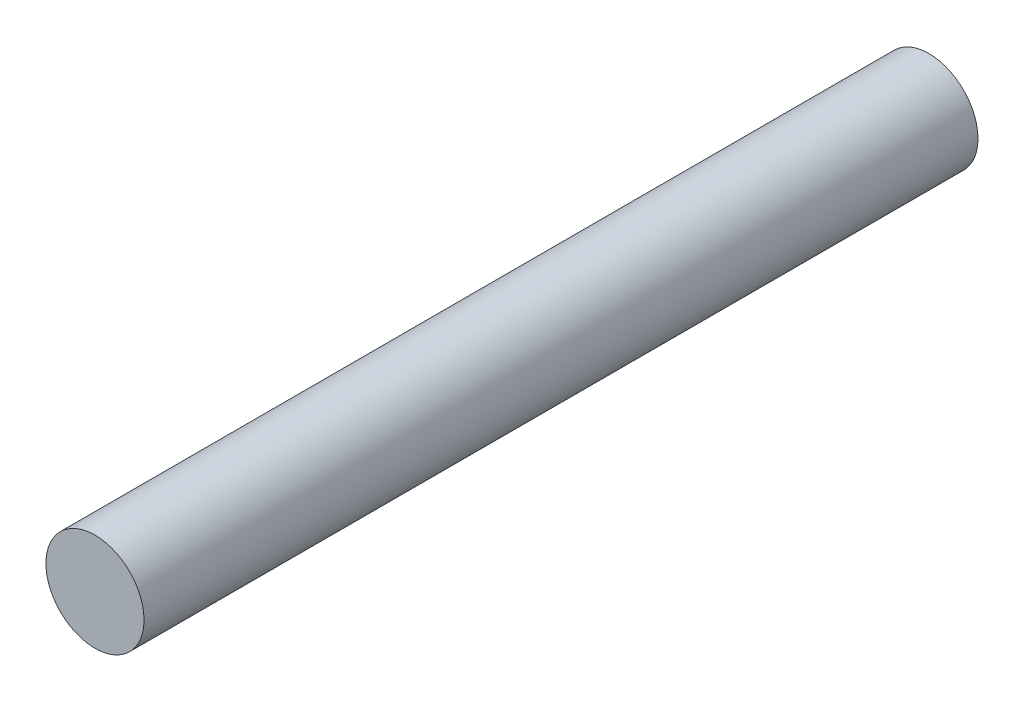
ISO-10303-21;
HEADER;
FILE_DESCRIPTION(('STEP AP214'),'2;1');
FILE_NAME('part.step','',(''),(''),'','','');
FILE_SCHEMA(('AUTOMOTIVE_DESIGN { 1 0 10303 214 1 1 1 1 }'));
ENDSEC;
DATA;
#1=APPLICATION_CONTEXT('core data for automotive mechanical design processes');
#2=APPLICATION_PROTOCOL_DEFINITION('international standard','automotive_design',2000,#1);
#3=PRODUCT_CONTEXT('',#1,'mechanical');
#4=PRODUCT('Part','Part','',(#3));
#5=PRODUCT_RELATED_PRODUCT_CATEGORY('part','',(#4));
#6=PRODUCT_DEFINITION_FORMATION('','',#4);
#7=PRODUCT_DEFINITION_CONTEXT('part definition',#1,'design');
#8=PRODUCT_DEFINITION('design','',#6,#7);
#9=PRODUCT_DEFINITION_SHAPE('','',#8);
#10=(LENGTH_UNIT() NAMED_UNIT(*) SI_UNIT(.MILLI.,.METRE.));
#11=(NAMED_UNIT(*) PLANE_ANGLE_UNIT() SI_UNIT($,.RADIAN.));
#12=(NAMED_UNIT(*) SI_UNIT($,.STERADIAN.) SOLID_ANGLE_UNIT());
#13=UNCERTAINTY_MEASURE_WITH_UNIT(LENGTH_MEASURE(1.E-05),#10,'distance_accuracy_value','');
#14=(GEOMETRIC_REPRESENTATION_CONTEXT(3) GLOBAL_UNCERTAINTY_ASSIGNED_CONTEXT((#13)) GLOBAL_UNIT_ASSIGNED_CONTEXT((#10,
#11,#12)) REPRESENTATION_CONTEXT('',''));
#15=CARTESIAN_POINT('',(0.,0.,0.));
#16=DIRECTION('',(0.,0.,1.));
#17=DIRECTION('',(1.,0.,0.));
#18=AXIS2_PLACEMENT_3D('',#15,#16,#17);
#19=CARTESIAN_POINT('',(0.,0.,-68.));
#20=DIRECTION('',(0.,0.,1.));
#21=DIRECTION('',(1.,0.,0.));
#22=AXIS2_PLACEMENT_3D('',#19,#20,#21);
#23=CYLINDRICAL_SURFACE('',#22,4.);
#24=CARTESIAN_POINT('',(0.,0.,-68.));
#25=DIRECTION('',(0.,0.,1.));
#26=DIRECTION('',(1.,0.,0.));
#27=AXIS2_PLACEMENT_3D('',#24,#25,#26);
#28=CIRCLE('',#27,4.);
#29=CARTESIAN_POINT('',(4.,0.,-68.));
#30=VERTEX_POINT('',#29);
#31=EDGE_CURVE('E10',#30,#30,#28,.T.);
#32=ORIENTED_EDGE('',*,*,#31,.T.);
#33=EDGE_LOOP('',(#32));
#34=FACE_BOUND('',#33,.T.);
#35=CARTESIAN_POINT('',(0.,0.,0.));
#36=DIRECTION('',(0.,0.,1.));
#37=DIRECTION('',(1.,0.,0.));
#38=AXIS2_PLACEMENT_3D('',#35,#36,#37);
#39=CIRCLE('',#38,4.);
#40=CARTESIAN_POINT('',(4.,0.,0.));
#41=VERTEX_POINT('',#40);
#42=EDGE_CURVE('E35',#41,#41,#39,.T.);
#43=ORIENTED_EDGE('',*,*,#42,.F.);
#44=EDGE_LOOP('',(#43));
#45=FACE_BOUND('',#44,.T.);
#46=ADVANCED_FACE('F32',(#34,#45),#23,.T.);
#47=CARTESIAN_POINT('',(0.,0.,-68.));
#48=DIRECTION('',(0.,0.,1.));
#49=DIRECTION('',(1.,0.,0.));
#50=AXIS2_PLACEMENT_3D('',#47,#48,#49);
#51=PLANE('',#50);
#52=ORIENTED_EDGE('',*,*,#31,.F.);
#53=EDGE_LOOP('',(#52));
#54=FACE_BOUND('',#53,.T.);
#55=ADVANCED_FACE('F47',(#54),#51,.F.);
#56=CARTESIAN_POINT('',(0.,0.,0.));
#57=DIRECTION('',(0.,0.,1.));
#58=DIRECTION('',(1.,0.,0.));
#59=AXIS2_PLACEMENT_3D('',#56,#57,#58);
#60=PLANE('',#59);
#61=ORIENTED_EDGE('',*,*,#42,.T.);
#62=EDGE_LOOP('',(#61));
#63=FACE_BOUND('',#62,.T.);
#64=ADVANCED_FACE('F44',(#63),#60,.T.);
#65=CLOSED_SHELL('',(#46,#55,#64));
#66=MANIFOLD_SOLID_BREP('B2',#65);
#67=ADVANCED_BREP_SHAPE_REPRESENTATION('',(#18,#66),#14);
#68=SHAPE_DEFINITION_REPRESENTATION(#9,#67);
ENDSEC;
END-ISO-10303-21;
